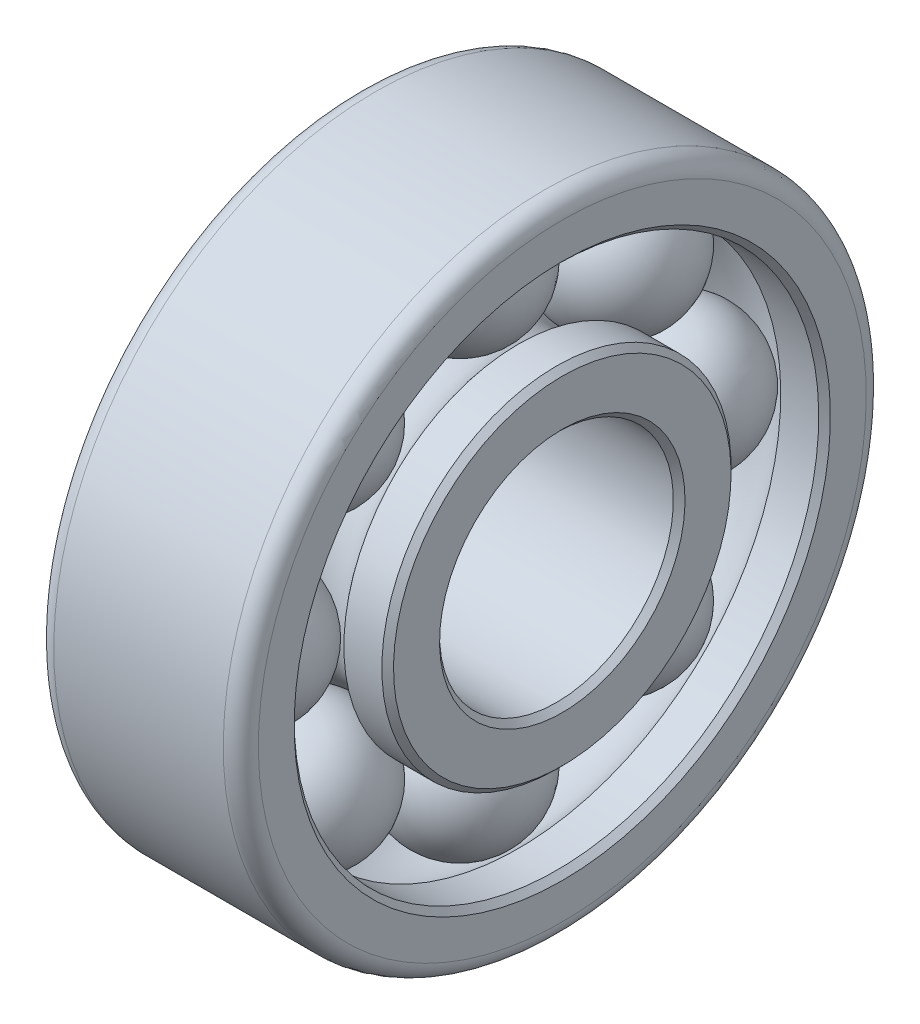
ISO-10303-21;
HEADER;
FILE_DESCRIPTION(('STEP AP214'),'2;1');
FILE_NAME('part.step','',(''),(''),'','','');
FILE_SCHEMA(('AUTOMOTIVE_DESIGN { 1 0 10303 214 1 1 1 1 }'));
ENDSEC;
DATA;
#1=APPLICATION_CONTEXT('core data for automotive mechanical design processes');
#2=APPLICATION_PROTOCOL_DEFINITION('international standard','automotive_design',2000,#1);
#3=PRODUCT_CONTEXT('',#1,'mechanical');
#4=PRODUCT('Part','Part','',(#3));
#5=PRODUCT_RELATED_PRODUCT_CATEGORY('part','',(#4));
#6=PRODUCT_DEFINITION_FORMATION('','',#4);
#7=PRODUCT_DEFINITION_CONTEXT('part definition',#1,'design');
#8=PRODUCT_DEFINITION('design','',#6,#7);
#9=PRODUCT_DEFINITION_SHAPE('','',#8);
#10=(LENGTH_UNIT() NAMED_UNIT(*) SI_UNIT(.MILLI.,.METRE.));
#11=(NAMED_UNIT(*) PLANE_ANGLE_UNIT() SI_UNIT($,.RADIAN.));
#12=(NAMED_UNIT(*) SI_UNIT($,.STERADIAN.) SOLID_ANGLE_UNIT());
#13=UNCERTAINTY_MEASURE_WITH_UNIT(LENGTH_MEASURE(1.E-05),#10,'distance_accuracy_value','');
#14=(GEOMETRIC_REPRESENTATION_CONTEXT(3) GLOBAL_UNCERTAINTY_ASSIGNED_CONTEXT((#13)) GLOBAL_UNIT_ASSIGNED_CONTEXT((#10,
#11,#12)) REPRESENTATION_CONTEXT('',''));
#15=CARTESIAN_POINT('',(0.,0.,0.));
#16=DIRECTION('',(0.,0.,1.));
#17=DIRECTION('',(1.,0.,0.));
#18=AXIS2_PLACEMENT_3D('',#15,#16,#17);
#19=CARTESIAN_POINT('',(0.,0.,0.));
#20=DIRECTION('',(0.,0.,1.));
#21=DIRECTION('',(1.,0.,0.));
#22=AXIS2_PLACEMENT_3D('',#19,#20,#21);
#23=SPHERICAL_SURFACE('',#22,2.4);
#24=CARTESIAN_POINT('',(0.,0.,2.4));
#25=VERTEX_POINT('',#24);
#26=VERTEX_LOOP('',#25);
#27=FACE_BOUND('',#26,.T.);
#28=ADVANCED_FACE('P0_F12',(#27),#23,.T.);
#29=CLOSED_SHELL('',(#28));
#30=MANIFOLD_SOLID_BREP('P0_B1',#29);
#31=CARTESIAN_POINT('',(0.,-7.47480661309374,0.));
#32=DIRECTION('',(1.,0.,0.));
#33=DIRECTION('',(0.,0.,-1.));
#34=AXIS2_PLACEMENT_3D('',#31,#32,#33);
#35=TOROIDAL_SURFACE('',#34,7.47480661309374,2.5);
#36=CARTESIAN_POINT('',(-2.,-7.47480661309374,0.));
#37=DIRECTION('',(1.,0.,0.));
#38=DIRECTION('',(0.,0.,-1.));
#39=AXIS2_PLACEMENT_3D('',#36,#37,#38);
#40=CIRCLE('',#39,5.97480661309374);
#41=CARTESIAN_POINT('',(-2.,-1.5,0.));
#42=VERTEX_POINT('',#41);
#43=EDGE_CURVE('P1_E67',#42,#42,#40,.T.);
#44=ORIENTED_EDGE('',*,*,#43,.T.);
#45=EDGE_LOOP('',(#44));
#46=FACE_BOUND('',#45,.T.);
#47=CARTESIAN_POINT('',(2.,-7.47480661309374,0.));
#48=DIRECTION('',(1.,0.,0.));
#49=DIRECTION('',(0.,0.,-1.));
#50=AXIS2_PLACEMENT_3D('',#47,#48,#49);
#51=CIRCLE('',#50,5.97480661309374);
#52=CARTESIAN_POINT('',(2.,-1.5,0.));
#53=VERTEX_POINT('',#52);
#54=EDGE_CURVE('P1_E11',#53,#53,#51,.T.);
#55=ORIENTED_EDGE('',*,*,#54,.F.);
#56=EDGE_LOOP('',(#55));
#57=FACE_BOUND('',#56,.T.);
#58=ADVANCED_FACE('P1_F16',(#46,#57),#35,.F.);
#59=CARTESIAN_POINT('',(3.4,-7.47480661309374,0.));
#60=DIRECTION('',(1.,0.,0.));
#61=DIRECTION('',(0.,-1.,0.));
#62=AXIS2_PLACEMENT_3D('',#59,#60,#61);
#63=CONICAL_SURFACE('',#62,4.1,0.785398163397454);
#64=CARTESIAN_POINT('',(3.3,-7.47480661309374,0.));
#65=DIRECTION('',(-1.,0.,0.));
#66=DIRECTION('',(0.,-1.,0.));
#67=AXIS2_PLACEMENT_3D('',#64,#65,#66);
#68=CIRCLE('',#67,4.);
#69=CARTESIAN_POINT('',(3.3,-3.47480661309374,0.));
#70=VERTEX_POINT('',#69);
#71=EDGE_CURVE('P1_E63',#70,#70,#68,.T.);
#72=ORIENTED_EDGE('',*,*,#71,.T.);
#73=EDGE_LOOP('',(#72));
#74=FACE_BOUND('',#73,.T.);
#75=CARTESIAN_POINT('',(3.5,-7.47480661309374,0.));
#76=DIRECTION('',(1.,0.,0.));
#77=DIRECTION('',(0.,-1.,0.));
#78=AXIS2_PLACEMENT_3D('',#75,#76,#77);
#79=CIRCLE('',#78,4.2);
#80=CARTESIAN_POINT('',(3.5,-3.27480661309373,0.));
#81=VERTEX_POINT('',#80);
#82=EDGE_CURVE('P1_E26',#81,#81,#79,.T.);
#83=ORIENTED_EDGE('',*,*,#82,.T.);
#84=EDGE_LOOP('',(#83));
#85=FACE_BOUND('',#84,.T.);
#86=ADVANCED_FACE('P1_F98',(#74,#85),#63,.F.);
#87=CARTESIAN_POINT('',(2.75,-7.47480661309374,0.));
#88=DIRECTION('',(-1.,0.,0.));
#89=DIRECTION('',(0.,1.,0.));
#90=AXIS2_PLACEMENT_3D('',#87,#88,#89);
#91=CYLINDRICAL_SURFACE('',#90,5.97480661309374);
#92=CARTESIAN_POINT('',(3.3,-7.47480661309374,0.));
#93=DIRECTION('',(1.,0.,0.));
#94=DIRECTION('',(0.,-1.,0.));
#95=AXIS2_PLACEMENT_3D('',#92,#93,#94);
#96=CIRCLE('',#95,5.97480661309374);
#97=CARTESIAN_POINT('',(3.3,-1.5,0.));
#98=VERTEX_POINT('',#97);
#99=EDGE_CURVE('P1_E19',#98,#98,#96,.T.);
#100=ORIENTED_EDGE('',*,*,#99,.F.);
#101=EDGE_LOOP('',(#100));
#102=FACE_BOUND('',#101,.T.);
#103=ORIENTED_EDGE('',*,*,#54,.T.);
#104=EDGE_LOOP('',(#103));
#105=FACE_BOUND('',#104,.T.);
#106=ADVANCED_FACE('P1_F103',(#102,#105),#91,.T.);
#107=CARTESIAN_POINT('',(3.5,-3.47480661309373,0.));
#108=DIRECTION('',(1.,0.,0.));
#109=DIRECTION('',(0.,0.,-1.));
#110=AXIS2_PLACEMENT_3D('',#107,#108,#109);
#111=PLANE('',#110);
#112=CARTESIAN_POINT('',(3.5,-7.47480661309374,0.));
#113=DIRECTION('',(-1.,0.,0.));
#114=DIRECTION('',(0.,-1.,0.));
#115=AXIS2_PLACEMENT_3D('',#112,#113,#114);
#116=CIRCLE('',#115,5.77480661309374);
#117=CARTESIAN_POINT('',(3.5,-1.7,0.));
#118=VERTEX_POINT('',#117);
#119=EDGE_CURVE('P1_E57',#118,#118,#116,.T.);
#120=ORIENTED_EDGE('',*,*,#119,.F.);
#121=EDGE_LOOP('',(#120));
#122=FACE_BOUND('',#121,.T.);
#123=ORIENTED_EDGE('',*,*,#82,.F.);
#124=EDGE_LOOP('',(#123));
#125=FACE_BOUND('',#124,.T.);
#126=ADVANCED_FACE('P1_F111',(#122,#125),#111,.T.);
#127=CARTESIAN_POINT('',(3.4,-7.47480661309374,0.));
#128=DIRECTION('',(-1.,0.,0.));
#129=DIRECTION('',(0.,-1.,0.));
#130=AXIS2_PLACEMENT_3D('',#127,#128,#129);
#131=CONICAL_SURFACE('',#130,5.87480661309374,0.785398163397447);
#132=ORIENTED_EDGE('',*,*,#119,.T.);
#133=EDGE_LOOP('',(#132));
#134=FACE_BOUND('',#133,.T.);
#135=ORIENTED_EDGE('',*,*,#99,.T.);
#136=EDGE_LOOP('',(#135));
#137=FACE_BOUND('',#136,.T.);
#138=ADVANCED_FACE('P1_F58',(#134,#137),#131,.T.);
#139=CARTESIAN_POINT('',(0.,-7.47480661309374,0.));
#140=DIRECTION('',(-1.,0.,0.));
#141=DIRECTION('',(0.,1.,0.));
#142=AXIS2_PLACEMENT_3D('',#139,#140,#141);
#143=CYLINDRICAL_SURFACE('',#142,4.);
#144=CARTESIAN_POINT('',(-3.3,-7.47480661309374,0.));
#145=DIRECTION('',(1.,0.,0.));
#146=DIRECTION('',(0.,-1.,0.));
#147=AXIS2_PLACEMENT_3D('',#144,#145,#146);
#148=CIRCLE('',#147,4.);
#149=CARTESIAN_POINT('',(-3.3,-3.47480661309374,0.));
#150=VERTEX_POINT('',#149);
#151=EDGE_CURVE('P1_E66',#150,#150,#148,.T.);
#152=ORIENTED_EDGE('',*,*,#151,.F.);
#153=EDGE_LOOP('',(#152));
#154=FACE_BOUND('',#153,.T.);
#155=ORIENTED_EDGE('',*,*,#71,.F.);
#156=EDGE_LOOP('',(#155));
#157=FACE_BOUND('',#156,.T.);
#158=ADVANCED_FACE('P1_F117',(#154,#157),#143,.F.);
#159=CARTESIAN_POINT('',(-3.4,-7.47480661309374,0.));
#160=DIRECTION('',(-1.,0.,0.));
#161=DIRECTION('',(0.,-1.,0.));
#162=AXIS2_PLACEMENT_3D('',#159,#160,#161);
#163=CONICAL_SURFACE('',#162,4.1,0.785398163397448);
#164=CARTESIAN_POINT('',(-3.5,-7.47480661309374,0.));
#165=DIRECTION('',(-1.,0.,0.));
#166=DIRECTION('',(0.,-1.,0.));
#167=AXIS2_PLACEMENT_3D('',#164,#165,#166);
#168=CIRCLE('',#167,4.2);
#169=CARTESIAN_POINT('',(-3.5,-3.27480661309374,0.));
#170=VERTEX_POINT('',#169);
#171=EDGE_CURVE('P1_E70',#170,#170,#168,.T.);
#172=ORIENTED_EDGE('',*,*,#171,.T.);
#173=EDGE_LOOP('',(#172));
#174=FACE_BOUND('',#173,.T.);
#175=ORIENTED_EDGE('',*,*,#151,.T.);
#176=EDGE_LOOP('',(#175));
#177=FACE_BOUND('',#176,.T.);
#178=ADVANCED_FACE('P1_F77',(#174,#177),#163,.F.);
#179=CARTESIAN_POINT('',(-2.75,-7.47480661309374,0.));
#180=DIRECTION('',(-1.,0.,0.));
#181=DIRECTION('',(0.,1.,0.));
#182=AXIS2_PLACEMENT_3D('',#179,#180,#181);
#183=CYLINDRICAL_SURFACE('',#182,5.97480661309374);
#184=CARTESIAN_POINT('',(-3.3,-7.47480661309374,0.));
#185=DIRECTION('',(-1.,0.,0.));
#186=DIRECTION('',(0.,-1.,0.));
#187=AXIS2_PLACEMENT_3D('',#184,#185,#186);
#188=CIRCLE('',#187,5.97480661309374);
#189=CARTESIAN_POINT('',(-3.3,-1.5,0.));
#190=VERTEX_POINT('',#189);
#191=EDGE_CURVE('P1_E74',#190,#190,#188,.T.);
#192=ORIENTED_EDGE('',*,*,#191,.F.);
#193=EDGE_LOOP('',(#192));
#194=FACE_BOUND('',#193,.T.);
#195=ORIENTED_EDGE('',*,*,#43,.F.);
#196=EDGE_LOOP('',(#195));
#197=FACE_BOUND('',#196,.T.);
#198=ADVANCED_FACE('P1_F83',(#194,#197),#183,.T.);
#199=CARTESIAN_POINT('',(-3.5,-1.5,0.));
#200=DIRECTION('',(-1.,0.,0.));
#201=DIRECTION('',(0.,0.,1.));
#202=AXIS2_PLACEMENT_3D('',#199,#200,#201);
#203=PLANE('',#202);
#204=CARTESIAN_POINT('',(-3.5,-7.47480661309374,0.));
#205=DIRECTION('',(1.,0.,0.));
#206=DIRECTION('',(0.,-1.,0.));
#207=AXIS2_PLACEMENT_3D('',#204,#205,#206);
#208=CIRCLE('',#207,5.77480661309374);
#209=CARTESIAN_POINT('',(-3.5,-1.7,0.));
#210=VERTEX_POINT('',#209);
#211=EDGE_CURVE('P1_E72',#210,#210,#208,.T.);
#212=ORIENTED_EDGE('',*,*,#211,.F.);
#213=EDGE_LOOP('',(#212));
#214=FACE_BOUND('',#213,.T.);
#215=ORIENTED_EDGE('',*,*,#171,.F.);
#216=EDGE_LOOP('',(#215));
#217=FACE_BOUND('',#216,.T.);
#218=ADVANCED_FACE('P1_F80',(#214,#217),#203,.T.);
#219=CARTESIAN_POINT('',(-3.4,-7.47480661309374,0.));
#220=DIRECTION('',(1.,0.,0.));
#221=DIRECTION('',(0.,-1.,0.));
#222=AXIS2_PLACEMENT_3D('',#219,#220,#221);
#223=CONICAL_SURFACE('',#222,5.87480661309374,0.785398163397448);
#224=ORIENTED_EDGE('',*,*,#191,.T.);
#225=EDGE_LOOP('',(#224));
#226=FACE_BOUND('',#225,.T.);
#227=ORIENTED_EDGE('',*,*,#211,.T.);
#228=EDGE_LOOP('',(#227));
#229=FACE_BOUND('',#228,.T.);
#230=ADVANCED_FACE('P1_F82',(#226,#229),#223,.T.);
#231=CLOSED_SHELL('',(#58,#86,#106,#126,#138,#158,#178,#198,#218,#230));
#232=MANIFOLD_SOLID_BREP('P1_B1',#231);
#233=CARTESIAN_POINT('',(0.,-7.47480661309374,0.));
#234=DIRECTION('',(1.,0.,0.));
#235=DIRECTION('',(0.,0.,-1.));
#236=AXIS2_PLACEMENT_3D('',#233,#234,#235);
#237=TOROIDAL_SURFACE('',#236,7.47480661309374,2.5);
#238=CARTESIAN_POINT('',(2.,-7.47480661309374,0.));
#239=DIRECTION('',(1.,0.,0.));
#240=DIRECTION('',(0.,0.,-1.));
#241=AXIS2_PLACEMENT_3D('',#238,#239,#240);
#242=CIRCLE('',#241,8.97480661309374);
#243=CARTESIAN_POINT('',(2.,1.5,0.));
#244=VERTEX_POINT('',#243);
#245=EDGE_CURVE('P2_E64',#244,#244,#242,.T.);
#246=ORIENTED_EDGE('',*,*,#245,.T.);
#247=EDGE_LOOP('',(#246));
#248=FACE_BOUND('',#247,.T.);
#249=CARTESIAN_POINT('',(-2.,-7.47480661309374,0.));
#250=DIRECTION('',(1.,0.,0.));
#251=DIRECTION('',(0.,0.,-1.));
#252=AXIS2_PLACEMENT_3D('',#249,#250,#251);
#253=CIRCLE('',#252,8.97480661309374);
#254=CARTESIAN_POINT('',(-2.,1.5,0.));
#255=VERTEX_POINT('',#254);
#256=EDGE_CURVE('P2_E122',#255,#255,#253,.T.);
#257=ORIENTED_EDGE('',*,*,#256,.F.);
#258=EDGE_LOOP('',(#257));
#259=FACE_BOUND('',#258,.T.);
#260=ADVANCED_FACE('P2_F16',(#248,#259),#237,.F.);
#261=CARTESIAN_POINT('',(2.9,-7.47480661309374,0.));
#262=DIRECTION('',(1.,0.,0.));
#263=DIRECTION('',(0.,0.,-1.));
#264=AXIS2_PLACEMENT_3D('',#261,#262,#263);
#265=TOROIDAL_SURFACE('',#264,10.4,0.6);
#266=CARTESIAN_POINT('',(2.9,-7.47480661309374,0.));
#267=DIRECTION('',(1.,0.,0.));
#268=DIRECTION('',(0.,0.,-1.));
#269=AXIS2_PLACEMENT_3D('',#266,#267,#268);
#270=CIRCLE('',#269,11.);
#271=CARTESIAN_POINT('',(2.9,3.52519338690627,0.));
#272=VERTEX_POINT('',#271);
#273=EDGE_CURVE('P2_E11',#272,#272,#270,.T.);
#274=ORIENTED_EDGE('',*,*,#273,.T.);
#275=EDGE_LOOP('',(#274));
#276=FACE_BOUND('',#275,.T.);
#277=CARTESIAN_POINT('',(3.5,-7.47480661309374,0.));
#278=DIRECTION('',(1.,0.,0.));
#279=DIRECTION('',(0.,0.,-1.));
#280=AXIS2_PLACEMENT_3D('',#277,#278,#279);
#281=CIRCLE('',#280,10.4);
#282=CARTESIAN_POINT('',(3.5,2.92519338690627,0.));
#283=VERTEX_POINT('',#282);
#284=EDGE_CURVE('P2_E60',#283,#283,#281,.T.);
#285=ORIENTED_EDGE('',*,*,#284,.F.);
#286=EDGE_LOOP('',(#285));
#287=FACE_BOUND('',#286,.T.);
#288=ADVANCED_FACE('P2_F97',(#276,#287),#265,.T.);
#289=CARTESIAN_POINT('',(0.,-7.47480661309374,0.));
#290=DIRECTION('',(-1.,0.,0.));
#291=DIRECTION('',(0.,1.,0.));
#292=AXIS2_PLACEMENT_3D('',#289,#290,#291);
#293=CYLINDRICAL_SURFACE('',#292,11.);
#294=CARTESIAN_POINT('',(-2.9,-7.47480661309374,0.));
#295=DIRECTION('',(1.,0.,0.));
#296=DIRECTION('',(0.,0.,-1.));
#297=AXIS2_PLACEMENT_3D('',#294,#295,#296);
#298=CIRCLE('',#297,11.);
#299=CARTESIAN_POINT('',(-2.9,3.52519338690627,0.));
#300=VERTEX_POINT('',#299);
#301=EDGE_CURVE('P2_E20',#300,#300,#298,.T.);
#302=ORIENTED_EDGE('',*,*,#301,.T.);
#303=EDGE_LOOP('',(#302));
#304=FACE_BOUND('',#303,.T.);
#305=ORIENTED_EDGE('',*,*,#273,.F.);
#306=EDGE_LOOP('',(#305));
#307=FACE_BOUND('',#306,.T.);
#308=ADVANCED_FACE('P2_F82',(#304,#307),#293,.T.);
#309=CARTESIAN_POINT('',(-2.9,-7.47480661309374,0.));
#310=DIRECTION('',(1.,0.,0.));
#311=DIRECTION('',(0.,0.,-1.));
#312=AXIS2_PLACEMENT_3D('',#309,#310,#311);
#313=TOROIDAL_SURFACE('',#312,10.4,0.6);
#314=CARTESIAN_POINT('',(-3.5,-7.47480661309374,0.));
#315=DIRECTION('',(1.,0.,0.));
#316=DIRECTION('',(0.,0.,-1.));
#317=AXIS2_PLACEMENT_3D('',#314,#315,#316);
#318=CIRCLE('',#317,10.4);
#319=CARTESIAN_POINT('',(-3.5,2.92519338690626,0.));
#320=VERTEX_POINT('',#319);
#321=EDGE_CURVE('P2_E66',#320,#320,#318,.T.);
#322=ORIENTED_EDGE('',*,*,#321,.T.);
#323=EDGE_LOOP('',(#322));
#324=FACE_BOUND('',#323,.T.);
#325=ORIENTED_EDGE('',*,*,#301,.F.);
#326=EDGE_LOOP('',(#325));
#327=FACE_BOUND('',#326,.T.);
#328=ADVANCED_FACE('P2_F85',(#324,#327),#313,.T.);
#329=CARTESIAN_POINT('',(2.75,-7.47480661309374,0.));
#330=DIRECTION('',(-1.,0.,0.));
#331=DIRECTION('',(0.,1.,0.));
#332=AXIS2_PLACEMENT_3D('',#329,#330,#331);
#333=CYLINDRICAL_SURFACE('',#332,8.97480661309374);
#334=CARTESIAN_POINT('',(3.3,-7.47480661309374,0.));
#335=DIRECTION('',(-1.,0.,0.));
#336=DIRECTION('',(0.,-1.,0.));
#337=AXIS2_PLACEMENT_3D('',#334,#335,#336);
#338=CIRCLE('',#337,8.97480661309374);
#339=CARTESIAN_POINT('',(3.3,1.5,0.));
#340=VERTEX_POINT('',#339);
#341=EDGE_CURVE('P2_E56',#340,#340,#338,.T.);
#342=ORIENTED_EDGE('',*,*,#341,.F.);
#343=EDGE_LOOP('',(#342));
#344=FACE_BOUND('',#343,.T.);
#345=ORIENTED_EDGE('',*,*,#245,.F.);
#346=EDGE_LOOP('',(#345));
#347=FACE_BOUND('',#346,.T.);
#348=ADVANCED_FACE('P2_F87',(#344,#347),#333,.F.);
#349=CARTESIAN_POINT('',(3.5,1.5,0.));
#350=DIRECTION('',(1.,0.,0.));
#351=DIRECTION('',(0.,0.,-1.));
#352=AXIS2_PLACEMENT_3D('',#349,#350,#351);
#353=PLANE('',#352);
#354=CARTESIAN_POINT('',(3.5,-7.47480661309374,0.));
#355=DIRECTION('',(1.,0.,0.));
#356=DIRECTION('',(0.,-1.,0.));
#357=AXIS2_PLACEMENT_3D('',#354,#355,#356);
#358=CIRCLE('',#357,9.17480661309374);
#359=CARTESIAN_POINT('',(3.5,1.7,0.));
#360=VERTEX_POINT('',#359);
#361=EDGE_CURVE('P2_E61',#360,#360,#358,.T.);
#362=ORIENTED_EDGE('',*,*,#361,.F.);
#363=EDGE_LOOP('',(#362));
#364=FACE_BOUND('',#363,.T.);
#365=ORIENTED_EDGE('',*,*,#284,.T.);
#366=EDGE_LOOP('',(#365));
#367=FACE_BOUND('',#366,.T.);
#368=ADVANCED_FACE('P2_F95',(#364,#367),#353,.T.);
#369=CARTESIAN_POINT('',(3.4,-7.47480661309374,0.));
#370=DIRECTION('',(1.,0.,0.));
#371=DIRECTION('',(0.,-1.,0.));
#372=AXIS2_PLACEMENT_3D('',#369,#370,#371);
#373=CONICAL_SURFACE('',#372,9.07480661309374,0.785398163397447);
#374=ORIENTED_EDGE('',*,*,#341,.T.);
#375=EDGE_LOOP('',(#374));
#376=FACE_BOUND('',#375,.T.);
#377=ORIENTED_EDGE('',*,*,#361,.T.);
#378=EDGE_LOOP('',(#377));
#379=FACE_BOUND('',#378,.T.);
#380=ADVANCED_FACE('P2_F57',(#376,#379),#373,.F.);
#381=CARTESIAN_POINT('',(-3.5,2.92519338690626,0.));
#382=DIRECTION('',(-1.,0.,0.));
#383=DIRECTION('',(0.,0.,1.));
#384=AXIS2_PLACEMENT_3D('',#381,#382,#383);
#385=PLANE('',#384);
#386=CARTESIAN_POINT('',(-3.5,-7.47480661309374,0.));
#387=DIRECTION('',(-1.,0.,0.));
#388=DIRECTION('',(0.,-1.,0.));
#389=AXIS2_PLACEMENT_3D('',#386,#387,#388);
#390=CIRCLE('',#389,9.17480661309374);
#391=CARTESIAN_POINT('',(-3.5,1.7,0.));
#392=VERTEX_POINT('',#391);
#393=EDGE_CURVE('P2_E71',#392,#392,#390,.T.);
#394=ORIENTED_EDGE('',*,*,#393,.F.);
#395=EDGE_LOOP('',(#394));
#396=FACE_BOUND('',#395,.T.);
#397=ORIENTED_EDGE('',*,*,#321,.F.);
#398=EDGE_LOOP('',(#397));
#399=FACE_BOUND('',#398,.T.);
#400=ADVANCED_FACE('P2_F109',(#396,#399),#385,.T.);
#401=CARTESIAN_POINT('',(-2.75,-7.47480661309374,0.));
#402=DIRECTION('',(-1.,0.,0.));
#403=DIRECTION('',(0.,1.,0.));
#404=AXIS2_PLACEMENT_3D('',#401,#402,#403);
#405=CYLINDRICAL_SURFACE('',#404,8.97480661309374);
#406=CARTESIAN_POINT('',(-3.3,-7.47480661309374,0.));
#407=DIRECTION('',(1.,0.,0.));
#408=DIRECTION('',(0.,-1.,0.));
#409=AXIS2_PLACEMENT_3D('',#406,#407,#408);
#410=CIRCLE('',#409,8.97480661309374);
#411=CARTESIAN_POINT('',(-3.3,1.5,0.));
#412=VERTEX_POINT('',#411);
#413=EDGE_CURVE('P2_E70',#412,#412,#410,.T.);
#414=ORIENTED_EDGE('',*,*,#413,.F.);
#415=EDGE_LOOP('',(#414));
#416=FACE_BOUND('',#415,.T.);
#417=ORIENTED_EDGE('',*,*,#256,.T.);
#418=EDGE_LOOP('',(#417));
#419=FACE_BOUND('',#418,.T.);
#420=ADVANCED_FACE('P2_F110',(#416,#419),#405,.F.);
#421=CARTESIAN_POINT('',(-3.4,-7.47480661309374,0.));
#422=DIRECTION('',(-1.,0.,0.));
#423=DIRECTION('',(0.,-1.,0.));
#424=AXIS2_PLACEMENT_3D('',#421,#422,#423);
#425=CONICAL_SURFACE('',#424,9.07480661309374,0.785398163397446);
#426=ORIENTED_EDGE('',*,*,#393,.T.);
#427=EDGE_LOOP('',(#426));
#428=FACE_BOUND('',#427,.T.);
#429=ORIENTED_EDGE('',*,*,#413,.T.);
#430=EDGE_LOOP('',(#429));
#431=FACE_BOUND('',#430,.T.);
#432=ADVANCED_FACE('P2_F18',(#428,#431),#425,.F.);
#433=CLOSED_SHELL('',(#260,#288,#308,#328,#348,#368,#380,#400,#420,#432));
#434=MANIFOLD_SOLID_BREP('P2_B1',#433);
#435=CARTESIAN_POINT('',(0.,-2.18932016891711,5.28548644417663));
#436=DIRECTION('',(0.,-0.707106781186548,0.707106781186548));
#437=DIRECTION('',(1.,0.,0.));
#438=AXIS2_PLACEMENT_3D('',#435,#436,#437);
#439=SPHERICAL_SURFACE('',#438,2.4);
#440=CARTESIAN_POINT('',(0.,-3.88637644376482,6.98254271902434));
#441=VERTEX_POINT('',#440);
#442=VERTEX_LOOP('',#441);
#443=FACE_BOUND('',#442,.T.);
#444=ADVANCED_FACE('P3_F12',(#443),#439,.T.);
#445=CLOSED_SHELL('',(#444));
#446=MANIFOLD_SOLID_BREP('P3_B1',#445);
#447=CARTESIAN_POINT('',(0.,-7.47480661309374,7.47480661309374));
#448=DIRECTION('',(0.,-1.,0.));
#449=DIRECTION('',(1.,0.,0.));
#450=AXIS2_PLACEMENT_3D('',#447,#448,#449);
#451=SPHERICAL_SURFACE('',#450,2.4);
#452=CARTESIAN_POINT('',(0.,-9.87480661309374,7.47480661309374));
#453=VERTEX_POINT('',#452);
#454=VERTEX_LOOP('',#453);
#455=FACE_BOUND('',#454,.T.);
#456=ADVANCED_FACE('P4_F12',(#455),#451,.T.);
#457=CLOSED_SHELL('',(#456));
#458=MANIFOLD_SOLID_BREP('P4_B1',#457);
#459=CARTESIAN_POINT('',(0.,-12.7602930572704,5.28548644417663));
#460=DIRECTION('',(0.,-0.707106781186548,-0.707106781186548));
#461=DIRECTION('',(1.,0.,0.));
#462=AXIS2_PLACEMENT_3D('',#459,#460,#461);
#463=SPHERICAL_SURFACE('',#462,2.4);
#464=CARTESIAN_POINT('',(0.,-14.4573493321181,3.58843016932892));
#465=VERTEX_POINT('',#464);
#466=VERTEX_LOOP('',#465);
#467=FACE_BOUND('',#466,.T.);
#468=ADVANCED_FACE('P5_F12',(#467),#463,.T.);
#469=CLOSED_SHELL('',(#468));
#470=MANIFOLD_SOLID_BREP('P5_B1',#469);
#471=CARTESIAN_POINT('',(0.,-14.9496132261875,0.));
#472=DIRECTION('',(0.,0.,-1.));
#473=DIRECTION('',(1.,0.,0.));
#474=AXIS2_PLACEMENT_3D('',#471,#472,#473);
#475=SPHERICAL_SURFACE('',#474,2.4);
#476=CARTESIAN_POINT('',(0.,-14.9496132261875,-2.4));
#477=VERTEX_POINT('',#476);
#478=VERTEX_LOOP('',#477);
#479=FACE_BOUND('',#478,.T.);
#480=ADVANCED_FACE('P6_F12',(#479),#475,.T.);
#481=CLOSED_SHELL('',(#480));
#482=MANIFOLD_SOLID_BREP('P6_B1',#481);
#483=CARTESIAN_POINT('',(0.,-12.7602930572704,-5.28548644417663));
#484=DIRECTION('',(0.,0.707106781186547,-0.707106781186548));
#485=DIRECTION('',(1.,0.,0.));
#486=AXIS2_PLACEMENT_3D('',#483,#484,#485);
#487=SPHERICAL_SURFACE('',#486,2.4);
#488=CARTESIAN_POINT('',(0.,-11.0632367824227,-6.98254271902434));
#489=VERTEX_POINT('',#488);
#490=VERTEX_LOOP('',#489);
#491=FACE_BOUND('',#490,.T.);
#492=ADVANCED_FACE('P7_F12',(#491),#487,.T.);
#493=CLOSED_SHELL('',(#492));
#494=MANIFOLD_SOLID_BREP('P7_B1',#493);
#495=CARTESIAN_POINT('',(0.,-7.47480661309374,-7.47480661309374));
#496=DIRECTION('',(0.,1.,0.));
#497=DIRECTION('',(1.,0.,0.));
#498=AXIS2_PLACEMENT_3D('',#495,#496,#497);
#499=SPHERICAL_SURFACE('',#498,2.4);
#500=CARTESIAN_POINT('',(0.,-5.07480661309374,-7.47480661309374));
#501=VERTEX_POINT('',#500);
#502=VERTEX_LOOP('',#501);
#503=FACE_BOUND('',#502,.T.);
#504=ADVANCED_FACE('P8_F12',(#503),#499,.T.);
#505=CLOSED_SHELL('',(#504));
#506=MANIFOLD_SOLID_BREP('P8_B1',#505);
#507=CARTESIAN_POINT('',(0.,-2.18932016891711,-5.28548644417663));
#508=DIRECTION('',(0.,0.707106781186548,0.707106781186547));
#509=DIRECTION('',(1.,0.,0.));
#510=AXIS2_PLACEMENT_3D('',#507,#508,#509);
#511=SPHERICAL_SURFACE('',#510,2.4);
#512=CARTESIAN_POINT('',(0.,-0.492263894069395,-3.58843016932892));
#513=VERTEX_POINT('',#512);
#514=VERTEX_LOOP('',#513);
#515=FACE_BOUND('',#514,.T.);
#516=ADVANCED_FACE('P9_F11',(#515),#511,.T.);
#517=CLOSED_SHELL('',(#516));
#518=MANIFOLD_SOLID_BREP('P9_B1',#517);
#519=ADVANCED_BREP_SHAPE_REPRESENTATION('',(#18,#30,#232,#434,#446,#458,#470,#482,#494,#506,
#518),#14);
#520=SHAPE_DEFINITION_REPRESENTATION(#9,#519);
ENDSEC;
END-ISO-10303-21;
